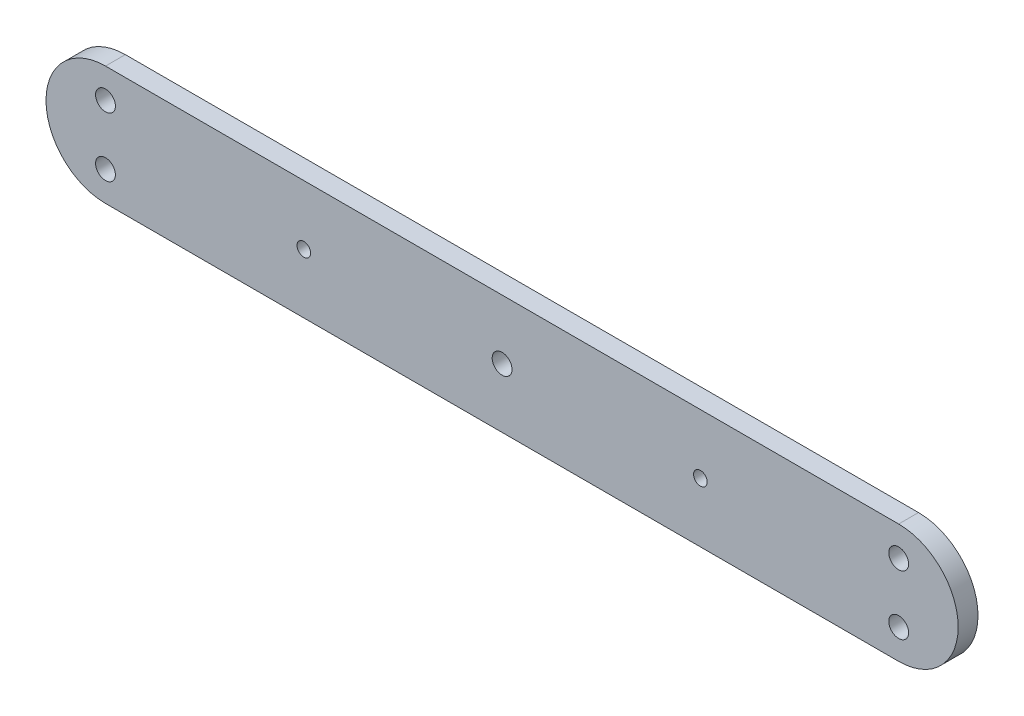
ISO-10303-21;
HEADER;
FILE_DESCRIPTION(('STEP AP214'),'2;1');
FILE_NAME('part.step','',(''),(''),'','','');
FILE_SCHEMA(('AUTOMOTIVE_DESIGN { 1 0 10303 214 1 1 1 1 }'));
ENDSEC;
DATA;
#1=APPLICATION_CONTEXT('core data for automotive mechanical design processes');
#2=APPLICATION_PROTOCOL_DEFINITION('international standard','automotive_design',2000,#1);
#3=PRODUCT_CONTEXT('',#1,'mechanical');
#4=PRODUCT('Part','Part','',(#3));
#5=PRODUCT_RELATED_PRODUCT_CATEGORY('part','',(#4));
#6=PRODUCT_DEFINITION_FORMATION('','',#4);
#7=PRODUCT_DEFINITION_CONTEXT('part definition',#1,'design');
#8=PRODUCT_DEFINITION('design','',#6,#7);
#9=PRODUCT_DEFINITION_SHAPE('','',#8);
#10=(LENGTH_UNIT() NAMED_UNIT(*) SI_UNIT(.MILLI.,.METRE.));
#11=(NAMED_UNIT(*) PLANE_ANGLE_UNIT() SI_UNIT($,.RADIAN.));
#12=(NAMED_UNIT(*) SI_UNIT($,.STERADIAN.) SOLID_ANGLE_UNIT());
#13=UNCERTAINTY_MEASURE_WITH_UNIT(LENGTH_MEASURE(1.E-05),#10,'distance_accuracy_value','');
#14=(GEOMETRIC_REPRESENTATION_CONTEXT(3) GLOBAL_UNCERTAINTY_ASSIGNED_CONTEXT((#13)) GLOBAL_UNIT_ASSIGNED_CONTEXT((#10,
#11,#12)) REPRESENTATION_CONTEXT('',''));
#15=CARTESIAN_POINT('',(0.,0.,0.));
#16=DIRECTION('',(0.,0.,1.));
#17=DIRECTION('',(1.,0.,0.));
#18=AXIS2_PLACEMENT_3D('',#15,#16,#17);
#19=CARTESIAN_POINT('',(-89.2432432432432,0.,6.35));
#20=DIRECTION('',(0.,0.,1.));
#21=DIRECTION('',(1.,0.,0.));
#22=AXIS2_PLACEMENT_3D('',#19,#20,#21);
#23=PLANE('',#22);
#24=CARTESIAN_POINT('',(101.256756756757,0.,6.35));
#25=DIRECTION('',(0.,0.,1.));
#26=DIRECTION('',(1.,0.,0.));
#27=AXIS2_PLACEMENT_3D('',#24,#25,#26);
#28=CIRCLE('',#27,2.1828125);
#29=CARTESIAN_POINT('',(103.439569256757,0.,6.35));
#30=VERTEX_POINT('',#29);
#31=EDGE_CURVE('E137',#30,#30,#28,.T.);
#32=ORIENTED_EDGE('',*,*,#31,.F.);
#33=EDGE_LOOP('',(#32));
#34=FACE_BOUND('',#33,.T.);
#35=CARTESIAN_POINT('',(-89.2432432432432,9.52500000000003,6.35));
#36=DIRECTION('',(0.,0.,1.));
#37=DIRECTION('',(1.,0.,0.));
#38=AXIS2_PLACEMENT_3D('',#35,#36,#37);
#39=CIRCLE('',#38,3.175);
#40=CARTESIAN_POINT('',(-86.0682432432432,9.52500000000003,6.35));
#41=VERTEX_POINT('',#40);
#42=EDGE_CURVE('E125',#41,#41,#39,.T.);
#43=ORIENTED_EDGE('',*,*,#42,.F.);
#44=EDGE_LOOP('',(#43));
#45=FACE_BOUND('',#44,.T.);
#46=CARTESIAN_POINT('',(37.7567567567568,0.,6.35));
#47=DIRECTION('',(0.,0.,1.));
#48=DIRECTION('',(1.,0.,0.));
#49=AXIS2_PLACEMENT_3D('',#46,#47,#48);
#50=CIRCLE('',#49,3.17500000000001);
#51=CARTESIAN_POINT('',(40.9317567567568,0.,6.35));
#52=VERTEX_POINT('',#51);
#53=EDGE_CURVE('E113',#52,#52,#50,.T.);
#54=ORIENTED_EDGE('',*,*,#53,.F.);
#55=EDGE_LOOP('',(#54));
#56=FACE_BOUND('',#55,.T.);
#57=CARTESIAN_POINT('',(-89.2432432432432,0.,6.35));
#58=DIRECTION('',(0.,0.,1.));
#59=DIRECTION('',(1.,0.,0.));
#60=AXIS2_PLACEMENT_3D('',#57,#58,#59);
#61=CIRCLE('',#60,19.05);
#62=CARTESIAN_POINT('',(-89.2432432432432,19.05,6.35));
#63=VERTEX_POINT('',#62);
#64=CARTESIAN_POINT('',(-89.2432432432432,-19.05,6.35));
#65=VERTEX_POINT('',#64);
#66=EDGE_CURVE('E83',#63,#65,#61,.T.);
#67=ORIENTED_EDGE('',*,*,#66,.T.);
#68=DIRECTION('',(1.,0.,0.));
#69=VECTOR('',#68,1.);
#70=CARTESIAN_POINT('',(-89.2432432432432,-19.05,6.35));
#71=LINE('',#70,#69);
#72=CARTESIAN_POINT('',(164.756756756757,-19.0500000000001,6.35));
#73=VERTEX_POINT('',#72);
#74=EDGE_CURVE('E78',#65,#73,#71,.T.);
#75=ORIENTED_EDGE('',*,*,#74,.T.);
#76=CARTESIAN_POINT('',(164.756756756757,0.,6.35));
#77=DIRECTION('',(0.,0.,1.));
#78=DIRECTION('',(1.,0.,0.));
#79=AXIS2_PLACEMENT_3D('',#76,#77,#78);
#80=CIRCLE('',#79,19.0500000000001);
#81=CARTESIAN_POINT('',(164.756756756757,19.0500000000001,6.35));
#82=VERTEX_POINT('',#81);
#83=EDGE_CURVE('E81',#73,#82,#80,.T.);
#84=ORIENTED_EDGE('',*,*,#83,.T.);
#85=DIRECTION('',(-1.,0.,0.));
#86=VECTOR('',#85,1.);
#87=CARTESIAN_POINT('',(-89.2432432432432,19.05,6.35));
#88=LINE('',#87,#86);
#89=EDGE_CURVE('E48',#82,#63,#88,.T.);
#90=ORIENTED_EDGE('',*,*,#89,.T.);
#91=EDGE_LOOP('',(#67,#75,#84,#90));
#92=FACE_BOUND('',#91,.T.);
#93=CARTESIAN_POINT('',(164.756756756757,-9.52500000000006,6.35));
#94=DIRECTION('',(0.,0.,1.));
#95=DIRECTION('',(1.,0.,0.));
#96=AXIS2_PLACEMENT_3D('',#93,#94,#95);
#97=CIRCLE('',#96,3.175);
#98=CARTESIAN_POINT('',(167.931756756757,-9.52500000000006,6.35));
#99=VERTEX_POINT('',#98);
#100=EDGE_CURVE('E98',#99,#99,#97,.T.);
#101=ORIENTED_EDGE('',*,*,#100,.F.);
#102=EDGE_LOOP('',(#101));
#103=FACE_BOUND('',#102,.T.);
#104=CARTESIAN_POINT('',(164.756756756757,9.52500000000006,6.35));
#105=DIRECTION('',(0.,0.,1.));
#106=DIRECTION('',(1.,0.,0.));
#107=AXIS2_PLACEMENT_3D('',#104,#105,#106);
#108=CIRCLE('',#107,3.175);
#109=CARTESIAN_POINT('',(167.931756756757,9.52500000000006,6.35));
#110=VERTEX_POINT('',#109);
#111=EDGE_CURVE('E119',#110,#110,#108,.T.);
#112=ORIENTED_EDGE('',*,*,#111,.F.);
#113=EDGE_LOOP('',(#112));
#114=FACE_BOUND('',#113,.T.);
#115=CARTESIAN_POINT('',(-25.7432432432432,0.,6.35));
#116=DIRECTION('',(0.,0.,1.));
#117=DIRECTION('',(1.,0.,0.));
#118=AXIS2_PLACEMENT_3D('',#115,#116,#117);
#119=CIRCLE('',#118,2.1828125);
#120=CARTESIAN_POINT('',(-23.5604307432432,0.,6.35));
#121=VERTEX_POINT('',#120);
#122=EDGE_CURVE('E131',#121,#121,#119,.T.);
#123=ORIENTED_EDGE('',*,*,#122,.F.);
#124=EDGE_LOOP('',(#123));
#125=FACE_BOUND('',#124,.T.);
#126=CARTESIAN_POINT('',(-89.2432432432432,-9.525,6.35));
#127=DIRECTION('',(0.,0.,1.));
#128=DIRECTION('',(1.,0.,0.));
#129=AXIS2_PLACEMENT_3D('',#126,#127,#128);
#130=CIRCLE('',#129,3.175);
#131=CARTESIAN_POINT('',(-86.0682432432432,-9.525,6.35));
#132=VERTEX_POINT('',#131);
#133=EDGE_CURVE('E143',#132,#132,#130,.T.);
#134=ORIENTED_EDGE('',*,*,#133,.F.);
#135=EDGE_LOOP('',(#134));
#136=FACE_BOUND('',#135,.T.);
#137=ADVANCED_FACE('F31',(#34,#45,#56,#92,#103,#114,#125,#136),#23,.T.);
#138=CARTESIAN_POINT('',(-89.2432432432432,0.,0.));
#139=DIRECTION('',(0.,0.,1.));
#140=DIRECTION('',(1.,0.,0.));
#141=AXIS2_PLACEMENT_3D('',#138,#139,#140);
#142=PLANE('',#141);
#143=CARTESIAN_POINT('',(-89.2432432432432,0.,0.));
#144=DIRECTION('',(0.,0.,1.));
#145=DIRECTION('',(1.,0.,0.));
#146=AXIS2_PLACEMENT_3D('',#143,#144,#145);
#147=CIRCLE('',#146,19.05);
#148=CARTESIAN_POINT('',(-89.2432432432432,19.05,0.));
#149=VERTEX_POINT('',#148);
#150=CARTESIAN_POINT('',(-89.2432432432432,-19.05,0.));
#151=VERTEX_POINT('',#150);
#152=EDGE_CURVE('E95',#149,#151,#147,.T.);
#153=ORIENTED_EDGE('',*,*,#152,.F.);
#154=DIRECTION('',(-1.,0.,0.));
#155=VECTOR('',#154,1.);
#156=CARTESIAN_POINT('',(-89.2432432432432,19.05,0.));
#157=LINE('',#156,#155);
#158=CARTESIAN_POINT('',(164.756756756757,19.0500000000001,0.));
#159=VERTEX_POINT('',#158);
#160=EDGE_CURVE('E71',#159,#149,#157,.T.);
#161=ORIENTED_EDGE('',*,*,#160,.F.);
#162=CARTESIAN_POINT('',(164.756756756757,0.,0.));
#163=DIRECTION('',(0.,0.,1.));
#164=DIRECTION('',(1.,0.,0.));
#165=AXIS2_PLACEMENT_3D('',#162,#163,#164);
#166=CIRCLE('',#165,19.0500000000001);
#167=CARTESIAN_POINT('',(164.756756756757,-19.0500000000001,0.));
#168=VERTEX_POINT('',#167);
#169=EDGE_CURVE('E65',#168,#159,#166,.T.);
#170=ORIENTED_EDGE('',*,*,#169,.F.);
#171=DIRECTION('',(1.,0.,0.));
#172=VECTOR('',#171,1.);
#173=CARTESIAN_POINT('',(-89.2432432432432,-19.05,0.));
#174=LINE('',#173,#172);
#175=EDGE_CURVE('E87',#151,#168,#174,.T.);
#176=ORIENTED_EDGE('',*,*,#175,.F.);
#177=EDGE_LOOP('',(#153,#161,#170,#176));
#178=FACE_BOUND('',#177,.T.);
#179=CARTESIAN_POINT('',(164.756756756757,-9.52500000000006,0.));
#180=DIRECTION('',(0.,0.,1.));
#181=DIRECTION('',(1.,0.,0.));
#182=AXIS2_PLACEMENT_3D('',#179,#180,#181);
#183=CIRCLE('',#182,3.175);
#184=CARTESIAN_POINT('',(167.931756756757,-9.52500000000006,0.));
#185=VERTEX_POINT('',#184);
#186=EDGE_CURVE('E110',#185,#185,#183,.T.);
#187=ORIENTED_EDGE('',*,*,#186,.T.);
#188=EDGE_LOOP('',(#187));
#189=FACE_BOUND('',#188,.T.);
#190=CARTESIAN_POINT('',(37.7567567567568,0.,0.));
#191=DIRECTION('',(0.,0.,1.));
#192=DIRECTION('',(1.,0.,0.));
#193=AXIS2_PLACEMENT_3D('',#190,#191,#192);
#194=CIRCLE('',#193,3.17500000000001);
#195=CARTESIAN_POINT('',(40.9317567567568,0.,0.));
#196=VERTEX_POINT('',#195);
#197=EDGE_CURVE('E116',#196,#196,#194,.T.);
#198=ORIENTED_EDGE('',*,*,#197,.T.);
#199=EDGE_LOOP('',(#198));
#200=FACE_BOUND('',#199,.T.);
#201=CARTESIAN_POINT('',(164.756756756757,9.52500000000006,0.));
#202=DIRECTION('',(0.,0.,1.));
#203=DIRECTION('',(1.,0.,0.));
#204=AXIS2_PLACEMENT_3D('',#201,#202,#203);
#205=CIRCLE('',#204,3.175);
#206=CARTESIAN_POINT('',(167.931756756757,9.52500000000006,0.));
#207=VERTEX_POINT('',#206);
#208=EDGE_CURVE('E122',#207,#207,#205,.T.);
#209=ORIENTED_EDGE('',*,*,#208,.T.);
#210=EDGE_LOOP('',(#209));
#211=FACE_BOUND('',#210,.T.);
#212=CARTESIAN_POINT('',(-89.2432432432432,9.52500000000003,0.));
#213=DIRECTION('',(0.,0.,1.));
#214=DIRECTION('',(1.,0.,0.));
#215=AXIS2_PLACEMENT_3D('',#212,#213,#214);
#216=CIRCLE('',#215,3.175);
#217=CARTESIAN_POINT('',(-86.0682432432432,9.52500000000003,0.));
#218=VERTEX_POINT('',#217);
#219=EDGE_CURVE('E128',#218,#218,#216,.T.);
#220=ORIENTED_EDGE('',*,*,#219,.T.);
#221=EDGE_LOOP('',(#220));
#222=FACE_BOUND('',#221,.T.);
#223=CARTESIAN_POINT('',(-25.7432432432432,0.,0.));
#224=DIRECTION('',(0.,0.,1.));
#225=DIRECTION('',(1.,0.,0.));
#226=AXIS2_PLACEMENT_3D('',#223,#224,#225);
#227=CIRCLE('',#226,2.1828125);
#228=CARTESIAN_POINT('',(-23.5604307432432,0.,0.));
#229=VERTEX_POINT('',#228);
#230=EDGE_CURVE('E134',#229,#229,#227,.T.);
#231=ORIENTED_EDGE('',*,*,#230,.T.);
#232=EDGE_LOOP('',(#231));
#233=FACE_BOUND('',#232,.T.);
#234=CARTESIAN_POINT('',(101.256756756757,0.,0.));
#235=DIRECTION('',(0.,0.,1.));
#236=DIRECTION('',(1.,0.,0.));
#237=AXIS2_PLACEMENT_3D('',#234,#235,#236);
#238=CIRCLE('',#237,2.1828125);
#239=CARTESIAN_POINT('',(103.439569256757,0.,0.));
#240=VERTEX_POINT('',#239);
#241=EDGE_CURVE('E140',#240,#240,#238,.T.);
#242=ORIENTED_EDGE('',*,*,#241,.T.);
#243=EDGE_LOOP('',(#242));
#244=FACE_BOUND('',#243,.T.);
#245=CARTESIAN_POINT('',(-89.2432432432432,-9.525,0.));
#246=DIRECTION('',(0.,0.,1.));
#247=DIRECTION('',(1.,0.,0.));
#248=AXIS2_PLACEMENT_3D('',#245,#246,#247);
#249=CIRCLE('',#248,3.175);
#250=CARTESIAN_POINT('',(-86.0682432432432,-9.525,0.));
#251=VERTEX_POINT('',#250);
#252=EDGE_CURVE('E146',#251,#251,#249,.T.);
#253=ORIENTED_EDGE('',*,*,#252,.T.);
#254=EDGE_LOOP('',(#253));
#255=FACE_BOUND('',#254,.T.);
#256=ADVANCED_FACE('F106',(#178,#189,#200,#211,#222,#233,#244,#255),#142,.F.);
#257=CARTESIAN_POINT('',(-89.2432432432432,0.,6.35));
#258=DIRECTION('',(0.,0.,-1.));
#259=DIRECTION('',(-1.,0.,0.));
#260=AXIS2_PLACEMENT_3D('',#257,#258,#259);
#261=CYLINDRICAL_SURFACE('',#260,19.05);
#262=ORIENTED_EDGE('',*,*,#152,.T.);
#263=DIRECTION('',(0.,0.,-1.));
#264=VECTOR('',#263,1.);
#265=CARTESIAN_POINT('',(-89.2432432432432,-19.05,6.35));
#266=LINE('',#265,#264);
#267=EDGE_CURVE('E11',#65,#151,#266,.T.);
#268=ORIENTED_EDGE('',*,*,#267,.F.);
#269=ORIENTED_EDGE('',*,*,#66,.F.);
#270=DIRECTION('',(0.,0.,-1.));
#271=VECTOR('',#270,1.);
#272=CARTESIAN_POINT('',(-89.2432432432432,19.05,6.35));
#273=LINE('',#272,#271);
#274=EDGE_CURVE('E91',#63,#149,#273,.T.);
#275=ORIENTED_EDGE('',*,*,#274,.T.);
#276=EDGE_LOOP('',(#262,#268,#269,#275));
#277=FACE_BOUND('',#276,.T.);
#278=ADVANCED_FACE('F33',(#277),#261,.T.);
#279=CARTESIAN_POINT('',(-89.2432432432432,-19.05,6.35));
#280=DIRECTION('',(0.,1.,0.));
#281=DIRECTION('',(-1.,0.,0.));
#282=AXIS2_PLACEMENT_3D('',#279,#280,#281);
#283=PLANE('',#282);
#284=ORIENTED_EDGE('',*,*,#175,.T.);
#285=DIRECTION('',(0.,0.,-1.));
#286=VECTOR('',#285,1.);
#287=CARTESIAN_POINT('',(164.756756756757,-19.0500000000001,6.35));
#288=LINE('',#287,#286);
#289=EDGE_CURVE('E40',#73,#168,#288,.T.);
#290=ORIENTED_EDGE('',*,*,#289,.F.);
#291=ORIENTED_EDGE('',*,*,#74,.F.);
#292=ORIENTED_EDGE('',*,*,#267,.T.);
#293=EDGE_LOOP('',(#284,#290,#291,#292));
#294=FACE_BOUND('',#293,.T.);
#295=ADVANCED_FACE('F86',(#294),#283,.F.);
#296=CARTESIAN_POINT('',(164.756756756757,0.,6.35));
#297=DIRECTION('',(0.,0.,-1.));
#298=DIRECTION('',(-1.,0.,0.));
#299=AXIS2_PLACEMENT_3D('',#296,#297,#298);
#300=CYLINDRICAL_SURFACE('',#299,19.0500000000001);
#301=ORIENTED_EDGE('',*,*,#169,.T.);
#302=DIRECTION('',(0.,0.,-1.));
#303=VECTOR('',#302,1.);
#304=CARTESIAN_POINT('',(164.756756756757,19.0500000000001,6.35));
#305=LINE('',#304,#303);
#306=EDGE_CURVE('E88',#82,#159,#305,.T.);
#307=ORIENTED_EDGE('',*,*,#306,.F.);
#308=ORIENTED_EDGE('',*,*,#83,.F.);
#309=ORIENTED_EDGE('',*,*,#289,.T.);
#310=EDGE_LOOP('',(#301,#307,#308,#309));
#311=FACE_BOUND('',#310,.T.);
#312=ADVANCED_FACE('F89',(#311),#300,.T.);
#313=CARTESIAN_POINT('',(-89.2432432432432,19.05,6.35));
#314=DIRECTION('',(0.,-1.,0.));
#315=DIRECTION('',(1.,0.,0.));
#316=AXIS2_PLACEMENT_3D('',#313,#314,#315);
#317=PLANE('',#316);
#318=ORIENTED_EDGE('',*,*,#160,.T.);
#319=ORIENTED_EDGE('',*,*,#274,.F.);
#320=ORIENTED_EDGE('',*,*,#89,.F.);
#321=ORIENTED_EDGE('',*,*,#306,.T.);
#322=EDGE_LOOP('',(#318,#319,#320,#321));
#323=FACE_BOUND('',#322,.T.);
#324=ADVANCED_FACE('F103',(#323),#317,.F.);
#325=CARTESIAN_POINT('',(164.756756756757,-9.52500000000006,6.35));
#326=DIRECTION('',(0.,0.,-1.));
#327=DIRECTION('',(-1.,0.,0.));
#328=AXIS2_PLACEMENT_3D('',#325,#326,#327);
#329=CYLINDRICAL_SURFACE('',#328,3.175);
#330=ORIENTED_EDGE('',*,*,#100,.T.);
#331=EDGE_LOOP('',(#330));
#332=FACE_BOUND('',#331,.T.);
#333=ORIENTED_EDGE('',*,*,#186,.F.);
#334=EDGE_LOOP('',(#333));
#335=FACE_BOUND('',#334,.T.);
#336=ADVANCED_FACE('F165',(#332,#335),#329,.F.);
#337=CARTESIAN_POINT('',(37.7567567567568,0.,6.35));
#338=DIRECTION('',(0.,0.,-1.));
#339=DIRECTION('',(-1.,0.,0.));
#340=AXIS2_PLACEMENT_3D('',#337,#338,#339);
#341=CYLINDRICAL_SURFACE('',#340,3.17500000000001);
#342=ORIENTED_EDGE('',*,*,#53,.T.);
#343=EDGE_LOOP('',(#342));
#344=FACE_BOUND('',#343,.T.);
#345=ORIENTED_EDGE('',*,*,#197,.F.);
#346=EDGE_LOOP('',(#345));
#347=FACE_BOUND('',#346,.T.);
#348=ADVANCED_FACE('F211',(#344,#347),#341,.F.);
#349=CARTESIAN_POINT('',(164.756756756757,9.52500000000006,6.35));
#350=DIRECTION('',(0.,0.,-1.));
#351=DIRECTION('',(-1.,0.,0.));
#352=AXIS2_PLACEMENT_3D('',#349,#350,#351);
#353=CYLINDRICAL_SURFACE('',#352,3.175);
#354=ORIENTED_EDGE('',*,*,#111,.T.);
#355=EDGE_LOOP('',(#354));
#356=FACE_BOUND('',#355,.T.);
#357=ORIENTED_EDGE('',*,*,#208,.F.);
#358=EDGE_LOOP('',(#357));
#359=FACE_BOUND('',#358,.T.);
#360=ADVANCED_FACE('F219',(#356,#359),#353,.F.);
#361=CARTESIAN_POINT('',(-89.2432432432432,9.52500000000003,6.35));
#362=DIRECTION('',(0.,0.,-1.));
#363=DIRECTION('',(-1.,0.,0.));
#364=AXIS2_PLACEMENT_3D('',#361,#362,#363);
#365=CYLINDRICAL_SURFACE('',#364,3.175);
#366=ORIENTED_EDGE('',*,*,#42,.T.);
#367=EDGE_LOOP('',(#366));
#368=FACE_BOUND('',#367,.T.);
#369=ORIENTED_EDGE('',*,*,#219,.F.);
#370=EDGE_LOOP('',(#369));
#371=FACE_BOUND('',#370,.T.);
#372=ADVANCED_FACE('F227',(#368,#371),#365,.F.);
#373=CARTESIAN_POINT('',(-25.7432432432432,0.,6.35));
#374=DIRECTION('',(0.,0.,-1.));
#375=DIRECTION('',(-1.,0.,0.));
#376=AXIS2_PLACEMENT_3D('',#373,#374,#375);
#377=CYLINDRICAL_SURFACE('',#376,2.1828125);
#378=ORIENTED_EDGE('',*,*,#122,.T.);
#379=EDGE_LOOP('',(#378));
#380=FACE_BOUND('',#379,.T.);
#381=ORIENTED_EDGE('',*,*,#230,.F.);
#382=EDGE_LOOP('',(#381));
#383=FACE_BOUND('',#382,.T.);
#384=ADVANCED_FACE('F236',(#380,#383),#377,.F.);
#385=CARTESIAN_POINT('',(101.256756756757,0.,6.35));
#386=DIRECTION('',(0.,0.,-1.));
#387=DIRECTION('',(-1.,0.,0.));
#388=AXIS2_PLACEMENT_3D('',#385,#386,#387);
#389=CYLINDRICAL_SURFACE('',#388,2.1828125);
#390=ORIENTED_EDGE('',*,*,#31,.T.);
#391=EDGE_LOOP('',(#390));
#392=FACE_BOUND('',#391,.T.);
#393=ORIENTED_EDGE('',*,*,#241,.F.);
#394=EDGE_LOOP('',(#393));
#395=FACE_BOUND('',#394,.T.);
#396=ADVANCED_FACE('F245',(#392,#395),#389,.F.);
#397=CARTESIAN_POINT('',(-89.2432432432432,-9.525,6.35));
#398=DIRECTION('',(0.,0.,-1.));
#399=DIRECTION('',(-1.,0.,0.));
#400=AXIS2_PLACEMENT_3D('',#397,#398,#399);
#401=CYLINDRICAL_SURFACE('',#400,3.175);
#402=ORIENTED_EDGE('',*,*,#133,.T.);
#403=EDGE_LOOP('',(#402));
#404=FACE_BOUND('',#403,.T.);
#405=ORIENTED_EDGE('',*,*,#252,.F.);
#406=EDGE_LOOP('',(#405));
#407=FACE_BOUND('',#406,.T.);
#408=ADVANCED_FACE('F152',(#404,#407),#401,.F.);
#409=CLOSED_SHELL('',(#137,#256,#278,#295,#312,#324,#336,#348,#360,#372,#384,#396,#408));
#410=MANIFOLD_SOLID_BREP('B2',#409);
#411=ADVANCED_BREP_SHAPE_REPRESENTATION('',(#18,#410),#14);
#412=SHAPE_DEFINITION_REPRESENTATION(#9,#411);
ENDSEC;
END-ISO-10303-21;
